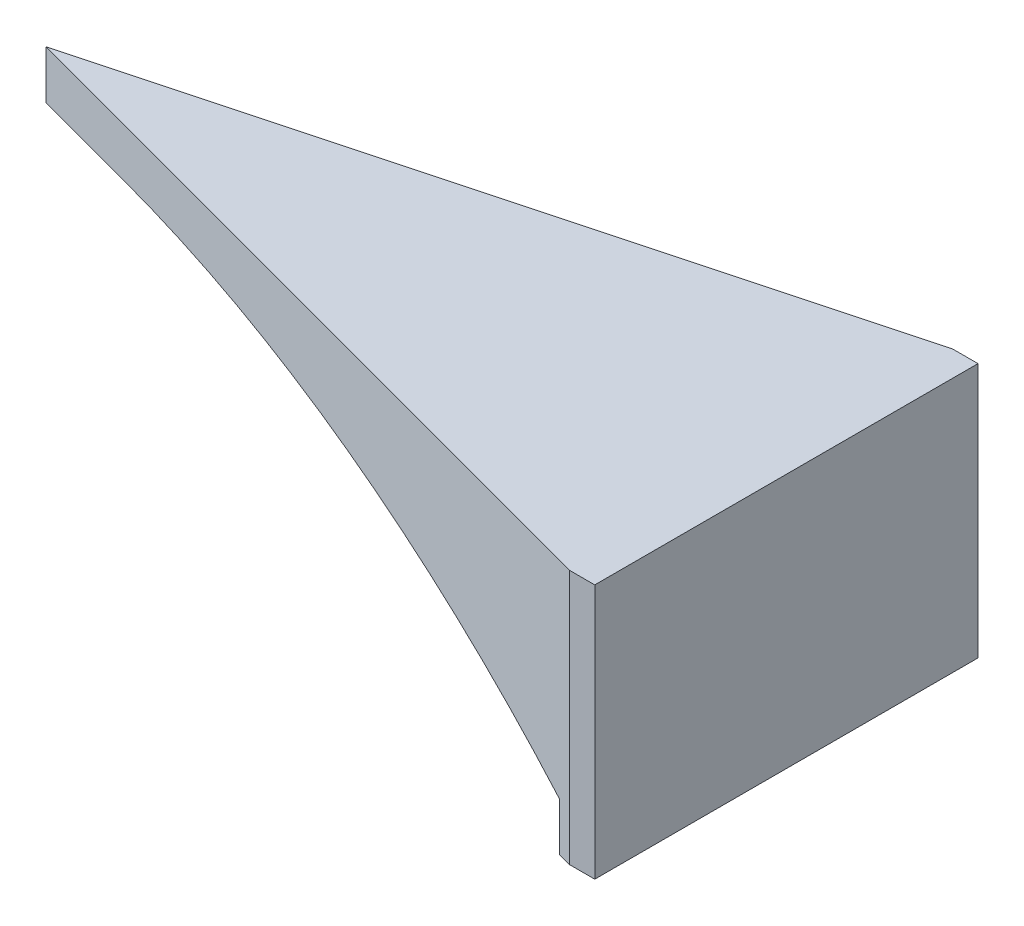
ISO-10303-21;
HEADER;
FILE_DESCRIPTION(('STEP AP214'),'2;1');
FILE_NAME('part.step','',(''),(''),'','','');
FILE_SCHEMA(('AUTOMOTIVE_DESIGN { 1 0 10303 214 1 1 1 1 }'));
ENDSEC;
DATA;
#1=APPLICATION_CONTEXT('core data for automotive mechanical design processes');
#2=APPLICATION_PROTOCOL_DEFINITION('international standard','automotive_design',2000,#1);
#3=PRODUCT_CONTEXT('',#1,'mechanical');
#4=PRODUCT('Part','Part','',(#3));
#5=PRODUCT_RELATED_PRODUCT_CATEGORY('part','',(#4));
#6=PRODUCT_DEFINITION_FORMATION('','',#4);
#7=PRODUCT_DEFINITION_CONTEXT('part definition',#1,'design');
#8=PRODUCT_DEFINITION('design','',#6,#7);
#9=PRODUCT_DEFINITION_SHAPE('','',#8);
#10=(LENGTH_UNIT() NAMED_UNIT(*) SI_UNIT(.MILLI.,.METRE.));
#11=(NAMED_UNIT(*) PLANE_ANGLE_UNIT() SI_UNIT($,.RADIAN.));
#12=(NAMED_UNIT(*) SI_UNIT($,.STERADIAN.) SOLID_ANGLE_UNIT());
#13=UNCERTAINTY_MEASURE_WITH_UNIT(LENGTH_MEASURE(1.E-05),#10,'distance_accuracy_value','');
#14=(GEOMETRIC_REPRESENTATION_CONTEXT(3) GLOBAL_UNCERTAINTY_ASSIGNED_CONTEXT((#13)) GLOBAL_UNIT_ASSIGNED_CONTEXT((#10,
#11,#12)) REPRESENTATION_CONTEXT('',''));
#15=CARTESIAN_POINT('',(0.,0.,0.));
#16=DIRECTION('',(0.,0.,1.));
#17=DIRECTION('',(1.,0.,0.));
#18=AXIS2_PLACEMENT_3D('',#15,#16,#17);
#19=CARTESIAN_POINT('',(0.,-530.163893918988,0.));
#20=DIRECTION('',(0.,-1.,0.));
#21=DIRECTION('',(0.,0.,-1.));
#22=AXIS2_PLACEMENT_3D('',#19,#20,#21);
#23=DEGENERATE_TOROIDAL_SURFACE('',#22,45.,530.163893918988,.T.);
#24=CARTESIAN_POINT('',(0.,-65.3534439338956,0.));
#25=DIRECTION('',(0.,-1.,0.));
#26=DIRECTION('',(0.,0.,-1.));
#27=AXIS2_PLACEMENT_3D('',#24,#25,#26);
#28=CIRCLE('',#27,300.);
#29=CARTESIAN_POINT('',(289.77774788672,-65.3534439338956,-77.6457135307563));
#30=VERTEX_POINT('',#29);
#31=CARTESIAN_POINT('',(289.77774788672,-65.3534439338956,77.6457135307564));
#32=VERTEX_POINT('',#31);
#33=EDGE_CURVE('E11',#30,#32,#28,.T.);
#34=ORIENTED_EDGE('',*,*,#33,.T.);
#35=CARTESIAN_POINT('',(43.4666621830081,-530.163893918988,11.6468570296135));
#36=DIRECTION('',(0.258819045102521,0.,-0.965925826289068));
#37=DIRECTION('',(0.965925826289068,0.,0.258819045102521));
#38=AXIS2_PLACEMENT_3D('',#35,#36,#37);
#39=CIRCLE('',#38,530.163893918988);
#40=CARTESIAN_POINT('',(43.466662183008,0.,11.6468570296135));
#41=VERTEX_POINT('',#40);
#42=EDGE_CURVE('E137',#41,#32,#39,.T.);
#43=ORIENTED_EDGE('',*,*,#42,.F.);
#44=CARTESIAN_POINT('',(0.,0.,0.));
#45=DIRECTION('',(0.,-1.,0.));
#46=DIRECTION('',(0.,0.,-1.));
#47=AXIS2_PLACEMENT_3D('',#44,#45,#46);
#48=CIRCLE('',#47,45.);
#49=CARTESIAN_POINT('',(43.466662183008,0.,-11.6468570296135));
#50=VERTEX_POINT('',#49);
#51=EDGE_CURVE('E52',#50,#41,#48,.T.);
#52=ORIENTED_EDGE('',*,*,#51,.F.);
#53=CARTESIAN_POINT('',(43.4666621830081,-530.163893918988,-11.6468570296135));
#54=DIRECTION('',(-0.258819045102521,0.,-0.965925826289068));
#55=DIRECTION('',(0.965925826289068,0.,-0.258819045102521));
#56=AXIS2_PLACEMENT_3D('',#53,#54,#55);
#57=CIRCLE('',#56,530.163893918988);
#58=EDGE_CURVE('E154',#50,#30,#57,.T.);
#59=ORIENTED_EDGE('',*,*,#58,.T.);
#60=EDGE_LOOP('',(#34,#43,#52,#59));
#61=FACE_BOUND('',#60,.T.);
#62=ADVANCED_FACE('F37',(#61),#23,.F.);
#63=CARTESIAN_POINT('',(0.,-993.411479488412,0.));
#64=DIRECTION('',(0.,-1.,0.));
#65=DIRECTION('',(0.,0.,-1.));
#66=AXIS2_PLACEMENT_3D('',#63,#64,#65);
#67=CYLINDRICAL_SURFACE('',#66,300.);
#68=CARTESIAN_POINT('',(0.,-85.3534439338957,0.));
#69=DIRECTION('',(0.,-1.,0.));
#70=DIRECTION('',(0.,0.,-1.));
#71=AXIS2_PLACEMENT_3D('',#68,#69,#70);
#72=CIRCLE('',#71,300.);
#73=CARTESIAN_POINT('',(289.77774788672,-85.3534439338957,-77.6457135307564));
#74=VERTEX_POINT('',#73);
#75=CARTESIAN_POINT('',(289.77774788672,-85.3534439338957,77.6457135307564));
#76=VERTEX_POINT('',#75);
#77=EDGE_CURVE('E45',#74,#76,#72,.T.);
#78=ORIENTED_EDGE('',*,*,#77,.T.);
#79=DIRECTION('',(0.,-1.,0.));
#80=VECTOR('',#79,1.);
#81=CARTESIAN_POINT('',(289.77774788672,-65.3534439338956,77.6457135307564));
#82=LINE('',#81,#80);
#83=EDGE_CURVE('E141',#32,#76,#82,.T.);
#84=ORIENTED_EDGE('',*,*,#83,.F.);
#85=ORIENTED_EDGE('',*,*,#33,.F.);
#86=DIRECTION('',(0.,-1.,0.));
#87=VECTOR('',#86,1.);
#88=CARTESIAN_POINT('',(289.77774788672,-65.3534439338956,-77.6457135307563));
#89=LINE('',#88,#87);
#90=EDGE_CURVE('E156',#30,#74,#89,.T.);
#91=ORIENTED_EDGE('',*,*,#90,.T.);
#92=EDGE_LOOP('',(#78,#84,#85,#91));
#93=FACE_BOUND('',#92,.T.);
#94=ADVANCED_FACE('F39',(#93),#67,.F.);
#95=CARTESIAN_POINT('',(295.573302844455,-85.3534439338957,-79.1986278013715));
#96=DIRECTION('',(0.,-1.,0.));
#97=DIRECTION('',(0.,0.,-1.));
#98=AXIS2_PLACEMENT_3D('',#95,#96,#97);
#99=PLANE('',#98);
#100=DIRECTION('',(0.965925826289068,0.,-0.258819045102521));
#101=VECTOR('',#100,1.);
#102=CARTESIAN_POINT('',(295.573302844455,-85.3534439338957,-79.1986278013715));
#103=LINE('',#102,#101);
#104=CARTESIAN_POINT('',(295.573302844455,-85.3534439338957,-79.1986278013715));
#105=VERTEX_POINT('',#104);
#106=EDGE_CURVE('E159',#74,#105,#103,.T.);
#107=ORIENTED_EDGE('',*,*,#106,.T.);
#108=DIRECTION('',(1.,0.,0.));
#109=VECTOR('',#108,1.);
#110=CARTESIAN_POINT('',(-0.00100000000002876,-85.3534439338957,-79.1986278013715));
#111=LINE('',#110,#109);
#112=CARTESIAN_POINT('',(306.,-85.3534439338957,-79.1986278013715));
#113=VERTEX_POINT('',#112);
#114=EDGE_CURVE('E125',#105,#113,#111,.T.);
#115=ORIENTED_EDGE('',*,*,#114,.T.);
#116=DIRECTION('',(0.,0.,-1.));
#117=VECTOR('',#116,1.);
#118=CARTESIAN_POINT('',(306.,-85.3534439338957,79.1986278013715));
#119=LINE('',#118,#117);
#120=CARTESIAN_POINT('',(306.,-85.3534439338957,79.1986278013715));
#121=VERTEX_POINT('',#120);
#122=EDGE_CURVE('E116',#121,#113,#119,.T.);
#123=ORIENTED_EDGE('',*,*,#122,.F.);
#124=DIRECTION('',(1.,0.,0.));
#125=VECTOR('',#124,1.);
#126=CARTESIAN_POINT('',(-0.00100000000002876,-85.3534439338957,79.1986278013715));
#127=LINE('',#126,#125);
#128=CARTESIAN_POINT('',(295.573302844455,-85.3534439338957,79.1986278013715));
#129=VERTEX_POINT('',#128);
#130=EDGE_CURVE('E135',#129,#121,#127,.T.);
#131=ORIENTED_EDGE('',*,*,#130,.F.);
#132=DIRECTION('',(0.965925826289068,0.,0.258819045102521));
#133=VECTOR('',#132,1.);
#134=CARTESIAN_POINT('',(295.573302844455,-85.3534439338957,79.1986278013715));
#135=LINE('',#134,#133);
#136=EDGE_CURVE('E144',#76,#129,#135,.T.);
#137=ORIENTED_EDGE('',*,*,#136,.F.);
#138=ORIENTED_EDGE('',*,*,#77,.F.);
#139=EDGE_LOOP('',(#107,#115,#123,#131,#137,#138));
#140=FACE_BOUND('',#139,.T.);
#141=ADVANCED_FACE('F176',(#140),#99,.T.);
#142=CARTESIAN_POINT('',(0.,20.,0.));
#143=DIRECTION('',(0.,1.,0.));
#144=DIRECTION('',(0.,0.,1.));
#145=AXIS2_PLACEMENT_3D('',#142,#143,#144);
#146=PLANE('',#145);
#147=DIRECTION('',(-0.965925826289068,0.,-0.258819045102521));
#148=VECTOR('',#147,1.);
#149=CARTESIAN_POINT('',(0.,20.,0.));
#150=LINE('',#149,#148);
#151=CARTESIAN_POINT('',(295.573302844455,20.,79.1986278013715));
#152=VERTEX_POINT('',#151);
#153=CARTESIAN_POINT('',(0.,20.,0.));
#154=VERTEX_POINT('',#153);
#155=EDGE_CURVE('E150',#152,#154,#150,.T.);
#156=ORIENTED_EDGE('',*,*,#155,.F.);
#157=DIRECTION('',(1.,0.,0.));
#158=VECTOR('',#157,1.);
#159=CARTESIAN_POINT('',(-0.00100000000002876,20.,79.1986278013715));
#160=LINE('',#159,#158);
#161=CARTESIAN_POINT('',(306.,20.,79.1986278013715));
#162=VERTEX_POINT('',#161);
#163=EDGE_CURVE('E110',#152,#162,#160,.T.);
#164=ORIENTED_EDGE('',*,*,#163,.T.);
#165=DIRECTION('',(0.,0.,1.));
#166=VECTOR('',#165,1.);
#167=CARTESIAN_POINT('',(306.,20.,-79.1986278013715));
#168=LINE('',#167,#166);
#169=CARTESIAN_POINT('',(306.,20.,-79.1986278013715));
#170=VERTEX_POINT('',#169);
#171=EDGE_CURVE('E103',#170,#162,#168,.T.);
#172=ORIENTED_EDGE('',*,*,#171,.F.);
#173=DIRECTION('',(1.,0.,0.));
#174=VECTOR('',#173,1.);
#175=CARTESIAN_POINT('',(-0.00100000000002876,20.,-79.1986278013715));
#176=LINE('',#175,#174);
#177=CARTESIAN_POINT('',(295.573302844455,20.,-79.1986278013715));
#178=VERTEX_POINT('',#177);
#179=EDGE_CURVE('E108',#178,#170,#176,.T.);
#180=ORIENTED_EDGE('',*,*,#179,.F.);
#181=DIRECTION('',(-0.965925826289068,0.,0.258819045102521));
#182=VECTOR('',#181,1.);
#183=CARTESIAN_POINT('',(0.,20.,0.));
#184=LINE('',#183,#182);
#185=EDGE_CURVE('E162',#178,#154,#184,.T.);
#186=ORIENTED_EDGE('',*,*,#185,.T.);
#187=EDGE_LOOP('',(#156,#164,#172,#180,#186));
#188=FACE_BOUND('',#187,.T.);
#189=ADVANCED_FACE('F106',(#188),#146,.T.);
#190=CARTESIAN_POINT('',(43.466662183008,0.,-11.6468570296135));
#191=DIRECTION('',(0.,-1.,0.));
#192=DIRECTION('',(0.,0.,-1.));
#193=AXIS2_PLACEMENT_3D('',#190,#191,#192);
#194=PLANE('',#193);
#195=DIRECTION('',(0.965925826289068,0.,-0.258819045102521));
#196=VECTOR('',#195,1.);
#197=CARTESIAN_POINT('',(43.466662183008,0.,-11.6468570296135));
#198=LINE('',#197,#196);
#199=CARTESIAN_POINT('',(0.,0.,0.));
#200=VERTEX_POINT('',#199);
#201=EDGE_CURVE('E166',#200,#50,#198,.T.);
#202=ORIENTED_EDGE('',*,*,#201,.T.);
#203=ORIENTED_EDGE('',*,*,#51,.T.);
#204=DIRECTION('',(0.965925826289068,0.,0.258819045102521));
#205=VECTOR('',#204,1.);
#206=CARTESIAN_POINT('',(43.466662183008,0.,11.6468570296135));
#207=LINE('',#206,#205);
#208=EDGE_CURVE('E59',#200,#41,#207,.T.);
#209=ORIENTED_EDGE('',*,*,#208,.F.);
#210=EDGE_LOOP('',(#202,#203,#209));
#211=FACE_BOUND('',#210,.T.);
#212=ADVANCED_FACE('F183',(#211),#194,.T.);
#213=CARTESIAN_POINT('',(43.4666621830081,-530.163893918988,-11.6468570296135));
#214=DIRECTION('',(0.258819045102521,0.,0.965925826289068));
#215=DIRECTION('',(0.965925826289068,0.,-0.258819045102521));
#216=AXIS2_PLACEMENT_3D('',#213,#214,#215);
#217=PLANE('',#216);
#218=ORIENTED_EDGE('',*,*,#58,.F.);
#219=ORIENTED_EDGE('',*,*,#201,.F.);
#220=DIRECTION('',(0.,-1.,0.));
#221=VECTOR('',#220,1.);
#222=CARTESIAN_POINT('',(0.,0.,0.));
#223=LINE('',#222,#221);
#224=EDGE_CURVE('E164',#154,#200,#223,.T.);
#225=ORIENTED_EDGE('',*,*,#224,.F.);
#226=ORIENTED_EDGE('',*,*,#185,.F.);
#227=DIRECTION('',(0.,1.,0.));
#228=VECTOR('',#227,1.);
#229=CARTESIAN_POINT('',(295.573302844455,20.,-79.1986278013715));
#230=LINE('',#229,#228);
#231=EDGE_CURVE('E124',#105,#178,#230,.T.);
#232=ORIENTED_EDGE('',*,*,#231,.F.);
#233=ORIENTED_EDGE('',*,*,#106,.F.);
#234=ORIENTED_EDGE('',*,*,#90,.F.);
#235=EDGE_LOOP('',(#218,#219,#225,#226,#232,#233,#234));
#236=FACE_BOUND('',#235,.T.);
#237=ADVANCED_FACE('F181',(#236),#217,.F.);
#238=CARTESIAN_POINT('',(43.4666621830081,-530.163893918988,11.6468570296135));
#239=DIRECTION('',(-0.258819045102521,0.,0.965925826289068));
#240=DIRECTION('',(0.965925826289068,0.,0.258819045102521));
#241=AXIS2_PLACEMENT_3D('',#238,#239,#240);
#242=PLANE('',#241);
#243=ORIENTED_EDGE('',*,*,#42,.T.);
#244=ORIENTED_EDGE('',*,*,#83,.T.);
#245=ORIENTED_EDGE('',*,*,#136,.T.);
#246=DIRECTION('',(0.,1.,0.));
#247=VECTOR('',#246,1.);
#248=CARTESIAN_POINT('',(295.573302844455,20.,79.1986278013715));
#249=LINE('',#248,#247);
#250=EDGE_CURVE('E147',#129,#152,#249,.T.);
#251=ORIENTED_EDGE('',*,*,#250,.T.);
#252=ORIENTED_EDGE('',*,*,#155,.T.);
#253=ORIENTED_EDGE('',*,*,#224,.T.);
#254=ORIENTED_EDGE('',*,*,#208,.T.);
#255=EDGE_LOOP('',(#243,#244,#245,#251,#252,#253,#254));
#256=FACE_BOUND('',#255,.T.);
#257=ADVANCED_FACE('F175',(#256),#242,.T.);
#258=CARTESIAN_POINT('',(306.,0.,0.));
#259=DIRECTION('',(1.,0.,0.));
#260=DIRECTION('',(0.,0.,-1.));
#261=AXIS2_PLACEMENT_3D('',#258,#259,#260);
#262=PLANE('',#261);
#263=ORIENTED_EDGE('',*,*,#122,.T.);
#264=DIRECTION('',(0.,1.,0.));
#265=VECTOR('',#264,1.);
#266=CARTESIAN_POINT('',(306.,-85.3534439338957,-79.1986278013715));
#267=LINE('',#266,#265);
#268=EDGE_CURVE('E122',#113,#170,#267,.T.);
#269=ORIENTED_EDGE('',*,*,#268,.T.);
#270=ORIENTED_EDGE('',*,*,#171,.T.);
#271=DIRECTION('',(0.,-1.,0.));
#272=VECTOR('',#271,1.);
#273=CARTESIAN_POINT('',(306.,-85.3534439338957,79.1986278013715));
#274=LINE('',#273,#272);
#275=EDGE_CURVE('E115',#162,#121,#274,.T.);
#276=ORIENTED_EDGE('',*,*,#275,.T.);
#277=EDGE_LOOP('',(#263,#269,#270,#276));
#278=FACE_BOUND('',#277,.T.);
#279=ADVANCED_FACE('F127',(#278),#262,.T.);
#280=CARTESIAN_POINT('',(-0.00100000000002876,-85.3534439338957,79.1986278013715));
#281=DIRECTION('',(0.,0.,1.));
#282=DIRECTION('',(1.,0.,0.));
#283=AXIS2_PLACEMENT_3D('',#280,#281,#282);
#284=PLANE('',#283);
#285=ORIENTED_EDGE('',*,*,#250,.F.);
#286=ORIENTED_EDGE('',*,*,#130,.T.);
#287=ORIENTED_EDGE('',*,*,#275,.F.);
#288=ORIENTED_EDGE('',*,*,#163,.F.);
#289=EDGE_LOOP('',(#285,#286,#287,#288));
#290=FACE_BOUND('',#289,.T.);
#291=ADVANCED_FACE('F179',(#290),#284,.T.);
#292=CARTESIAN_POINT('',(-0.00100000000002876,-85.3534439338957,-79.1986278013715));
#293=DIRECTION('',(0.,0.,-1.));
#294=DIRECTION('',(-1.,0.,0.));
#295=AXIS2_PLACEMENT_3D('',#292,#293,#294);
#296=PLANE('',#295);
#297=ORIENTED_EDGE('',*,*,#231,.T.);
#298=ORIENTED_EDGE('',*,*,#179,.T.);
#299=ORIENTED_EDGE('',*,*,#268,.F.);
#300=ORIENTED_EDGE('',*,*,#114,.F.);
#301=EDGE_LOOP('',(#297,#298,#299,#300));
#302=FACE_BOUND('',#301,.T.);
#303=ADVANCED_FACE('F120',(#302),#296,.T.);
#304=CLOSED_SHELL('',(#62,#94,#141,#189,#212,#237,#257,#279,#291,#303));
#305=MANIFOLD_SOLID_BREP('B2',#304);
#306=ADVANCED_BREP_SHAPE_REPRESENTATION('',(#18,#305),#14);
#307=SHAPE_DEFINITION_REPRESENTATION(#9,#306);
ENDSEC;
END-ISO-10303-21;
